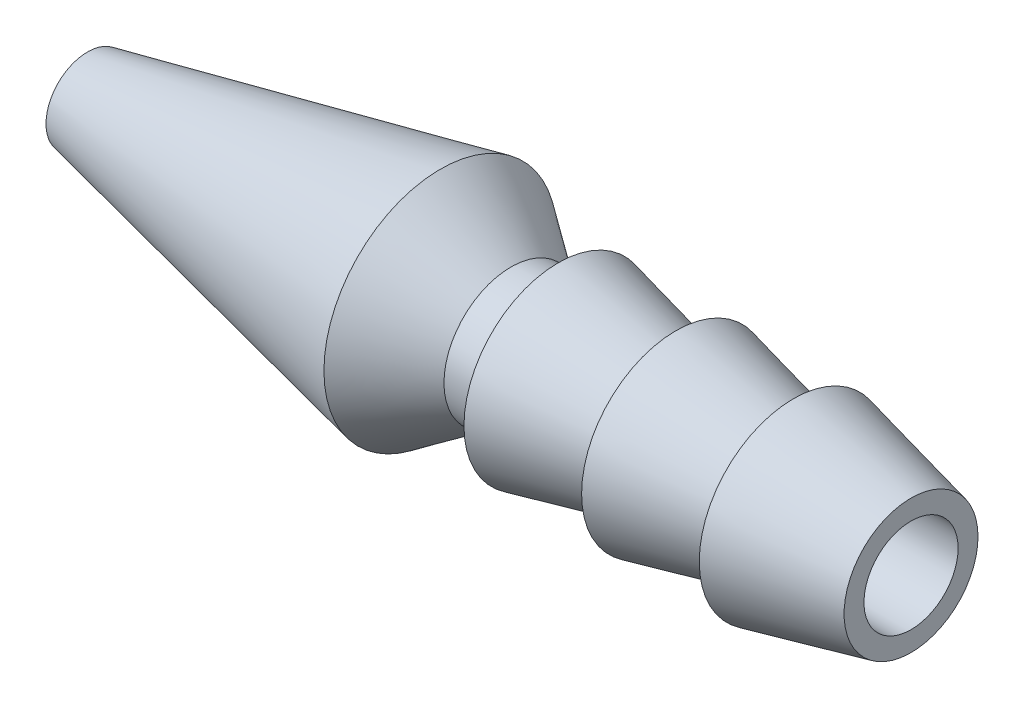
ISO-10303-21;
HEADER;
FILE_DESCRIPTION(('STEP AP214'),'2;1');
FILE_NAME('part.step','',(''),(''),'','','');
FILE_SCHEMA(('AUTOMOTIVE_DESIGN { 1 0 10303 214 1 1 1 1 }'));
ENDSEC;
DATA;
#1=APPLICATION_CONTEXT('core data for automotive mechanical design processes');
#2=APPLICATION_PROTOCOL_DEFINITION('international standard','automotive_design',2000,#1);
#3=PRODUCT_CONTEXT('',#1,'mechanical');
#4=PRODUCT('Part','Part','',(#3));
#5=PRODUCT_RELATED_PRODUCT_CATEGORY('part','',(#4));
#6=PRODUCT_DEFINITION_FORMATION('','',#4);
#7=PRODUCT_DEFINITION_CONTEXT('part definition',#1,'design');
#8=PRODUCT_DEFINITION('design','',#6,#7);
#9=PRODUCT_DEFINITION_SHAPE('','',#8);
#10=(LENGTH_UNIT() NAMED_UNIT(*) SI_UNIT(.MILLI.,.METRE.));
#11=(NAMED_UNIT(*) PLANE_ANGLE_UNIT() SI_UNIT($,.RADIAN.));
#12=(NAMED_UNIT(*) SI_UNIT($,.STERADIAN.) SOLID_ANGLE_UNIT());
#13=UNCERTAINTY_MEASURE_WITH_UNIT(LENGTH_MEASURE(1.E-05),#10,'distance_accuracy_value','');
#14=(GEOMETRIC_REPRESENTATION_CONTEXT(3) GLOBAL_UNCERTAINTY_ASSIGNED_CONTEXT((#13)) GLOBAL_UNIT_ASSIGNED_CONTEXT((#10,
#11,#12)) REPRESENTATION_CONTEXT('',''));
#15=CARTESIAN_POINT('',(0.,0.,0.));
#16=DIRECTION('',(0.,0.,1.));
#17=DIRECTION('',(1.,0.,0.));
#18=AXIS2_PLACEMENT_3D('',#15,#16,#17);
#19=CARTESIAN_POINT('',(0.,0.,0.));
#20=DIRECTION('',(-1.,0.,0.));
#21=DIRECTION('',(0.,0.,-1.));
#22=AXIS2_PLACEMENT_3D('',#19,#20,#21);
#23=CONICAL_SURFACE('',#22,4.,0.226892802759263);
#24=CARTESIAN_POINT('',(5.,0.,0.));
#25=DIRECTION('',(1.,0.,0.));
#26=DIRECTION('',(0.,0.,-1.));
#27=AXIS2_PLACEMENT_3D('',#24,#25,#26);
#28=CIRCLE('',#27,2.84565904437218);
#29=CARTESIAN_POINT('',(5.,0.,-2.84565904437218));
#30=VERTEX_POINT('',#29);
#31=EDGE_CURVE('E34',#30,#30,#28,.T.);
#32=ORIENTED_EDGE('',*,*,#31,.F.);
#33=EDGE_LOOP('',(#32));
#34=FACE_BOUND('',#33,.T.);
#35=CARTESIAN_POINT('',(0.,0.,0.));
#36=DIRECTION('',(1.,0.,0.));
#37=DIRECTION('',(0.,0.,-1.));
#38=AXIS2_PLACEMENT_3D('',#35,#36,#37);
#39=CIRCLE('',#38,4.);
#40=CARTESIAN_POINT('',(0.,0.,-4.));
#41=VERTEX_POINT('',#40);
#42=EDGE_CURVE('E42',#41,#41,#39,.T.);
#43=ORIENTED_EDGE('',*,*,#42,.T.);
#44=EDGE_LOOP('',(#43));
#45=FACE_BOUND('',#44,.T.);
#46=ADVANCED_FACE('F31',(#34,#45),#23,.T.);
#47=CARTESIAN_POINT('',(0.,0.,0.));
#48=DIRECTION('',(1.,0.,0.));
#49=DIRECTION('',(0.,0.,-1.));
#50=AXIS2_PLACEMENT_3D('',#47,#48,#49);
#51=PLANE('',#50);
#52=CARTESIAN_POINT('',(0.,0.,0.));
#53=DIRECTION('',(-1.,0.,0.));
#54=DIRECTION('',(0.,0.,1.));
#55=AXIS2_PLACEMENT_3D('',#52,#53,#54);
#56=CIRCLE('',#55,2.85);
#57=CARTESIAN_POINT('',(0.,0.,2.85));
#58=VERTEX_POINT('',#57);
#59=EDGE_CURVE('E10',#58,#58,#56,.T.);
#60=ORIENTED_EDGE('',*,*,#59,.F.);
#61=EDGE_LOOP('',(#60));
#62=FACE_BOUND('',#61,.T.);
#63=ORIENTED_EDGE('',*,*,#42,.F.);
#64=EDGE_LOOP('',(#63));
#65=FACE_BOUND('',#64,.T.);
#66=ADVANCED_FACE('F62',(#62,#65),#51,.F.);
#67=CARTESIAN_POINT('',(5.,0.,0.));
#68=DIRECTION('',(-1.,0.,0.));
#69=DIRECTION('',(0.,0.,-1.));
#70=AXIS2_PLACEMENT_3D('',#67,#68,#69);
#71=CONICAL_SURFACE('',#70,4.,0.226892802759263);
#72=CARTESIAN_POINT('',(10.,0.,0.));
#73=DIRECTION('',(1.,0.,0.));
#74=DIRECTION('',(0.,0.,-1.));
#75=AXIS2_PLACEMENT_3D('',#72,#73,#74);
#76=CIRCLE('',#75,2.84565904437218);
#77=CARTESIAN_POINT('',(10.,0.,-2.84565904437218));
#78=VERTEX_POINT('',#77);
#79=EDGE_CURVE('E56',#78,#78,#76,.T.);
#80=ORIENTED_EDGE('',*,*,#79,.F.);
#81=EDGE_LOOP('',(#80));
#82=FACE_BOUND('',#81,.T.);
#83=CARTESIAN_POINT('',(5.,0.,0.));
#84=DIRECTION('',(1.,0.,0.));
#85=DIRECTION('',(0.,0.,-1.));
#86=AXIS2_PLACEMENT_3D('',#83,#84,#85);
#87=CIRCLE('',#86,4.);
#88=CARTESIAN_POINT('',(5.,0.,-4.));
#89=VERTEX_POINT('',#88);
#90=EDGE_CURVE('E53',#89,#89,#87,.T.);
#91=ORIENTED_EDGE('',*,*,#90,.T.);
#92=EDGE_LOOP('',(#91));
#93=FACE_BOUND('',#92,.T.);
#94=ADVANCED_FACE('F64',(#82,#93),#71,.T.);
#95=CARTESIAN_POINT('',(5.,0.,0.));
#96=DIRECTION('',(1.,0.,0.));
#97=DIRECTION('',(0.,0.,-1.));
#98=AXIS2_PLACEMENT_3D('',#95,#96,#97);
#99=PLANE('',#98);
#100=ORIENTED_EDGE('',*,*,#31,.T.);
#101=EDGE_LOOP('',(#100));
#102=FACE_BOUND('',#101,.T.);
#103=ORIENTED_EDGE('',*,*,#90,.F.);
#104=EDGE_LOOP('',(#103));
#105=FACE_BOUND('',#104,.T.);
#106=ADVANCED_FACE('F70',(#102,#105),#99,.F.);
#107=CARTESIAN_POINT('',(10.,0.,0.));
#108=DIRECTION('',(-1.,0.,0.));
#109=DIRECTION('',(0.,0.,-1.));
#110=AXIS2_PLACEMENT_3D('',#107,#108,#109);
#111=CONICAL_SURFACE('',#110,4.,0.226892802759263);
#112=CARTESIAN_POINT('',(15.,0.,0.));
#113=DIRECTION('',(1.,0.,0.));
#114=DIRECTION('',(0.,0.,-1.));
#115=AXIS2_PLACEMENT_3D('',#112,#113,#114);
#116=CIRCLE('',#115,2.84565904437218);
#117=CARTESIAN_POINT('',(15.,0.,-2.84565904437218));
#118=VERTEX_POINT('',#117);
#119=EDGE_CURVE('E50',#118,#118,#116,.T.);
#120=ORIENTED_EDGE('',*,*,#119,.F.);
#121=EDGE_LOOP('',(#120));
#122=FACE_BOUND('',#121,.T.);
#123=CARTESIAN_POINT('',(10.,0.,0.));
#124=DIRECTION('',(1.,0.,0.));
#125=DIRECTION('',(0.,0.,-1.));
#126=AXIS2_PLACEMENT_3D('',#123,#124,#125);
#127=CIRCLE('',#126,4.);
#128=CARTESIAN_POINT('',(10.,0.,-4.));
#129=VERTEX_POINT('',#128);
#130=EDGE_CURVE('E47',#129,#129,#127,.T.);
#131=ORIENTED_EDGE('',*,*,#130,.T.);
#132=EDGE_LOOP('',(#131));
#133=FACE_BOUND('',#132,.T.);
#134=ADVANCED_FACE('F77',(#122,#133),#111,.T.);
#135=CARTESIAN_POINT('',(15.,0.,0.));
#136=DIRECTION('',(1.,0.,0.));
#137=DIRECTION('',(0.,0.,-1.));
#138=AXIS2_PLACEMENT_3D('',#135,#136,#137);
#139=PLANE('',#138);
#140=CARTESIAN_POINT('',(15.,0.,0.));
#141=DIRECTION('',(1.,0.,0.));
#142=DIRECTION('',(0.,0.,-1.));
#143=AXIS2_PLACEMENT_3D('',#140,#141,#142);
#144=CIRCLE('',#143,2.);
#145=CARTESIAN_POINT('',(15.,0.,-2.));
#146=VERTEX_POINT('',#145);
#147=EDGE_CURVE('E119',#146,#146,#144,.T.);
#148=ORIENTED_EDGE('',*,*,#147,.F.);
#149=EDGE_LOOP('',(#148));
#150=FACE_BOUND('',#149,.T.);
#151=ORIENTED_EDGE('',*,*,#119,.T.);
#152=EDGE_LOOP('',(#151));
#153=FACE_BOUND('',#152,.T.);
#154=ADVANCED_FACE('F81',(#150,#153),#139,.T.);
#155=CARTESIAN_POINT('',(10.,0.,0.));
#156=DIRECTION('',(1.,0.,0.));
#157=DIRECTION('',(0.,0.,-1.));
#158=AXIS2_PLACEMENT_3D('',#155,#156,#157);
#159=PLANE('',#158);
#160=ORIENTED_EDGE('',*,*,#79,.T.);
#161=EDGE_LOOP('',(#160));
#162=FACE_BOUND('',#161,.T.);
#163=ORIENTED_EDGE('',*,*,#130,.F.);
#164=EDGE_LOOP('',(#163));
#165=FACE_BOUND('',#164,.T.);
#166=ADVANCED_FACE('F83',(#162,#165),#159,.F.);
#167=CARTESIAN_POINT('',(-2.,0.,0.));
#168=DIRECTION('',(1.,0.,0.));
#169=DIRECTION('',(0.,0.,-1.));
#170=AXIS2_PLACEMENT_3D('',#167,#168,#169);
#171=CYLINDRICAL_SURFACE('',#170,2.85);
#172=CARTESIAN_POINT('',(-2.,0.,0.));
#173=DIRECTION('',(-1.,0.,0.));
#174=DIRECTION('',(0.,0.,1.));
#175=AXIS2_PLACEMENT_3D('',#172,#173,#174);
#176=CIRCLE('',#175,2.85);
#177=CARTESIAN_POINT('',(-2.,0.,2.85));
#178=VERTEX_POINT('',#177);
#179=EDGE_CURVE('E45',#178,#178,#176,.T.);
#180=ORIENTED_EDGE('',*,*,#179,.F.);
#181=EDGE_LOOP('',(#180));
#182=FACE_BOUND('',#181,.T.);
#183=ORIENTED_EDGE('',*,*,#59,.T.);
#184=EDGE_LOOP('',(#183));
#185=FACE_BOUND('',#184,.T.);
#186=ADVANCED_FACE('F86',(#182,#185),#171,.T.);
#187=CARTESIAN_POINT('',(-2.,0.,0.));
#188=DIRECTION('',(-1.,0.,0.));
#189=DIRECTION('',(0.,0.,1.));
#190=AXIS2_PLACEMENT_3D('',#187,#188,#189);
#191=CONICAL_SURFACE('',#190,2.85,0.610865238198016);
#192=CARTESIAN_POINT('',(-5.,0.,0.));
#193=DIRECTION('',(-1.,0.,0.));
#194=DIRECTION('',(0.,0.,1.));
#195=AXIS2_PLACEMENT_3D('',#192,#193,#194);
#196=CIRCLE('',#195,4.95062261462913);
#197=CARTESIAN_POINT('',(-5.,0.,4.95062261462913));
#198=VERTEX_POINT('',#197);
#199=EDGE_CURVE('E122',#198,#198,#196,.T.);
#200=ORIENTED_EDGE('',*,*,#199,.F.);
#201=EDGE_LOOP('',(#200));
#202=FACE_BOUND('',#201,.T.);
#203=ORIENTED_EDGE('',*,*,#179,.T.);
#204=EDGE_LOOP('',(#203));
#205=FACE_BOUND('',#204,.T.);
#206=ADVANCED_FACE('F93',(#202,#205),#191,.T.);
#207=CARTESIAN_POINT('',(-5.,0.,0.));
#208=DIRECTION('',(1.,0.,0.));
#209=DIRECTION('',(0.,0.,1.));
#210=AXIS2_PLACEMENT_3D('',#207,#208,#209);
#211=CONICAL_SURFACE('',#210,4.95062261462913,0.20943951023932);
#212=CARTESIAN_POINT('',(-20.,0.,0.));
#213=DIRECTION('',(-1.,0.,0.));
#214=DIRECTION('',(0.,0.,1.));
#215=AXIS2_PLACEMENT_3D('',#212,#213,#214);
#216=CIRCLE('',#215,1.7622741895788);
#217=CARTESIAN_POINT('',(-20.,0.,1.7622741895788));
#218=VERTEX_POINT('',#217);
#219=EDGE_CURVE('E118',#218,#218,#216,.T.);
#220=ORIENTED_EDGE('',*,*,#219,.F.);
#221=EDGE_LOOP('',(#220));
#222=FACE_BOUND('',#221,.T.);
#223=ORIENTED_EDGE('',*,*,#199,.T.);
#224=EDGE_LOOP('',(#223));
#225=FACE_BOUND('',#224,.T.);
#226=ADVANCED_FACE('F97',(#222,#225),#211,.T.);
#227=CARTESIAN_POINT('',(-20.,0.,0.));
#228=DIRECTION('',(-1.,0.,0.));
#229=DIRECTION('',(0.,0.,1.));
#230=AXIS2_PLACEMENT_3D('',#227,#228,#229);
#231=PLANE('',#230);
#232=ORIENTED_EDGE('',*,*,#219,.T.);
#233=EDGE_LOOP('',(#232));
#234=FACE_BOUND('',#233,.T.);
#235=ADVANCED_FACE('F101',(#234),#231,.T.);
#236=CARTESIAN_POINT('',(-5.,0.,0.));
#237=DIRECTION('',(1.,0.,0.));
#238=DIRECTION('',(0.,0.,-1.));
#239=AXIS2_PLACEMENT_3D('',#236,#237,#238);
#240=CYLINDRICAL_SURFACE('',#239,2.);
#241=CARTESIAN_POINT('',(-5.,0.,0.));
#242=DIRECTION('',(1.,0.,0.));
#243=DIRECTION('',(0.,0.,-1.));
#244=AXIS2_PLACEMENT_3D('',#241,#242,#243);
#245=CIRCLE('',#244,2.);
#246=CARTESIAN_POINT('',(-5.,0.,-2.));
#247=VERTEX_POINT('',#246);
#248=EDGE_CURVE('E117',#247,#247,#245,.T.);
#249=ORIENTED_EDGE('',*,*,#248,.F.);
#250=EDGE_LOOP('',(#249));
#251=FACE_BOUND('',#250,.T.);
#252=ORIENTED_EDGE('',*,*,#147,.T.);
#253=EDGE_LOOP('',(#252));
#254=FACE_BOUND('',#253,.T.);
#255=ADVANCED_FACE('F105',(#251,#254),#240,.F.);
#256=CARTESIAN_POINT('',(-5.,0.,0.));
#257=DIRECTION('',(1.,0.,0.));
#258=DIRECTION('',(0.,0.,-1.));
#259=AXIS2_PLACEMENT_3D('',#256,#257,#258);
#260=PLANE('',#259);
#261=ORIENTED_EDGE('',*,*,#248,.T.);
#262=EDGE_LOOP('',(#261));
#263=FACE_BOUND('',#262,.T.);
#264=ADVANCED_FACE('F109',(#263),#260,.T.);
#265=CLOSED_SHELL('',(#46,#66,#94,#106,#134,#154,#166,#186,#206,#226,#235,#255,#264));
#266=MANIFOLD_SOLID_BREP('B2',#265);
#267=ADVANCED_BREP_SHAPE_REPRESENTATION('',(#18,#266),#14);
#268=SHAPE_DEFINITION_REPRESENTATION(#9,#267);
ENDSEC;
END-ISO-10303-21;
